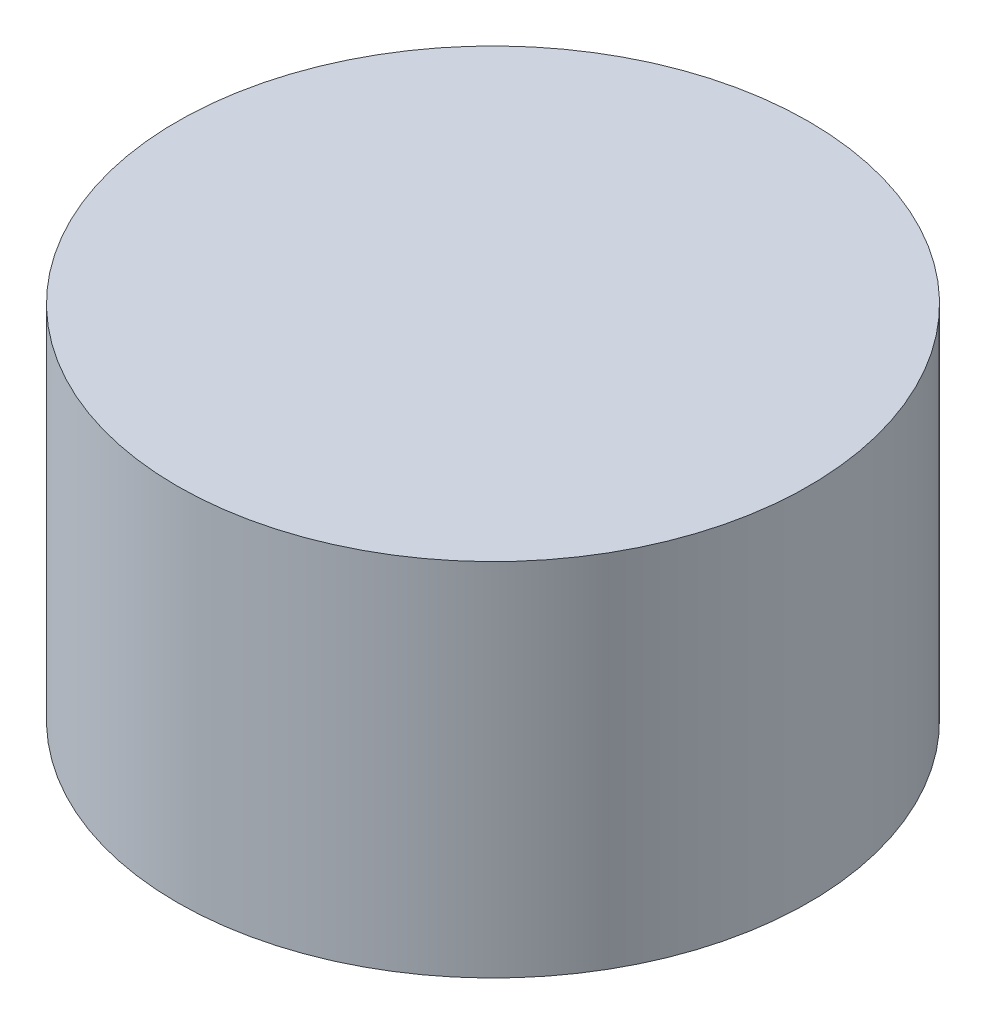
ISO-10303-21;
HEADER;
FILE_DESCRIPTION(('STEP AP214'),'2;1');
FILE_NAME('part.step','',(''),(''),'','','');
FILE_SCHEMA(('AUTOMOTIVE_DESIGN { 1 0 10303 214 1 1 1 1 }'));
ENDSEC;
DATA;
#1=APPLICATION_CONTEXT('core data for automotive mechanical design processes');
#2=APPLICATION_PROTOCOL_DEFINITION('international standard','automotive_design',2000,#1);
#3=PRODUCT_CONTEXT('',#1,'mechanical');
#4=PRODUCT('Part','Part','',(#3));
#5=PRODUCT_RELATED_PRODUCT_CATEGORY('part','',(#4));
#6=PRODUCT_DEFINITION_FORMATION('','',#4);
#7=PRODUCT_DEFINITION_CONTEXT('part definition',#1,'design');
#8=PRODUCT_DEFINITION('design','',#6,#7);
#9=PRODUCT_DEFINITION_SHAPE('','',#8);
#10=(LENGTH_UNIT() NAMED_UNIT(*) SI_UNIT(.MILLI.,.METRE.));
#11=(NAMED_UNIT(*) PLANE_ANGLE_UNIT() SI_UNIT($,.RADIAN.));
#12=(NAMED_UNIT(*) SI_UNIT($,.STERADIAN.) SOLID_ANGLE_UNIT());
#13=UNCERTAINTY_MEASURE_WITH_UNIT(LENGTH_MEASURE(1.E-05),#10,'distance_accuracy_value','');
#14=(GEOMETRIC_REPRESENTATION_CONTEXT(3) GLOBAL_UNCERTAINTY_ASSIGNED_CONTEXT((#13)) GLOBAL_UNIT_ASSIGNED_CONTEXT((#10,
#11,#12)) REPRESENTATION_CONTEXT('',''));
#15=CARTESIAN_POINT('',(0.,0.,0.));
#16=DIRECTION('',(0.,0.,1.));
#17=DIRECTION('',(1.,0.,0.));
#18=AXIS2_PLACEMENT_3D('',#15,#16,#17);
#19=CARTESIAN_POINT('',(0.,43.,0.));
#20=DIRECTION('',(0.,-1.,0.));
#21=DIRECTION('',(0.,0.,-1.));
#22=AXIS2_PLACEMENT_3D('',#19,#20,#21);
#23=CYLINDRICAL_SURFACE('',#22,37.6511140017235);
#24=CARTESIAN_POINT('',(0.,43.,0.));
#25=DIRECTION('',(0.,1.,0.));
#26=DIRECTION('',(0.,0.,1.));
#27=AXIS2_PLACEMENT_3D('',#24,#25,#26);
#28=CIRCLE('',#27,37.6511140017235);
#29=CARTESIAN_POINT('',(0.,43.,37.6511140017235));
#30=VERTEX_POINT('',#29);
#31=EDGE_CURVE('E10',#30,#30,#28,.T.);
#32=ORIENTED_EDGE('',*,*,#31,.F.);
#33=EDGE_LOOP('',(#32));
#34=FACE_BOUND('',#33,.T.);
#35=CARTESIAN_POINT('',(0.,0.,0.));
#36=DIRECTION('',(0.,1.,0.));
#37=DIRECTION('',(0.,0.,1.));
#38=AXIS2_PLACEMENT_3D('',#35,#36,#37);
#39=CIRCLE('',#38,37.6511140017235);
#40=CARTESIAN_POINT('',(0.,0.,37.6511140017235));
#41=VERTEX_POINT('',#40);
#42=EDGE_CURVE('E33',#41,#41,#39,.T.);
#43=ORIENTED_EDGE('',*,*,#42,.T.);
#44=EDGE_LOOP('',(#43));
#45=FACE_BOUND('',#44,.T.);
#46=ADVANCED_FACE('F30',(#34,#45),#23,.T.);
#47=CARTESIAN_POINT('',(0.,43.,0.));
#48=DIRECTION('',(0.,1.,0.));
#49=DIRECTION('',(0.,0.,1.));
#50=AXIS2_PLACEMENT_3D('',#47,#48,#49);
#51=PLANE('',#50);
#52=ORIENTED_EDGE('',*,*,#31,.T.);
#53=EDGE_LOOP('',(#52));
#54=FACE_BOUND('',#53,.T.);
#55=ADVANCED_FACE('F45',(#54),#51,.T.);
#56=CARTESIAN_POINT('',(0.,0.,0.));
#57=DIRECTION('',(0.,1.,0.));
#58=DIRECTION('',(0.,0.,1.));
#59=AXIS2_PLACEMENT_3D('',#56,#57,#58);
#60=PLANE('',#59);
#61=ORIENTED_EDGE('',*,*,#42,.F.);
#62=EDGE_LOOP('',(#61));
#63=FACE_BOUND('',#62,.T.);
#64=ADVANCED_FACE('F43',(#63),#60,.F.);
#65=CLOSED_SHELL('',(#46,#55,#64));
#66=MANIFOLD_SOLID_BREP('B2',#65);
#67=ADVANCED_BREP_SHAPE_REPRESENTATION('',(#18,#66),#14);
#68=SHAPE_DEFINITION_REPRESENTATION(#9,#67);
ENDSEC;
END-ISO-10303-21;
